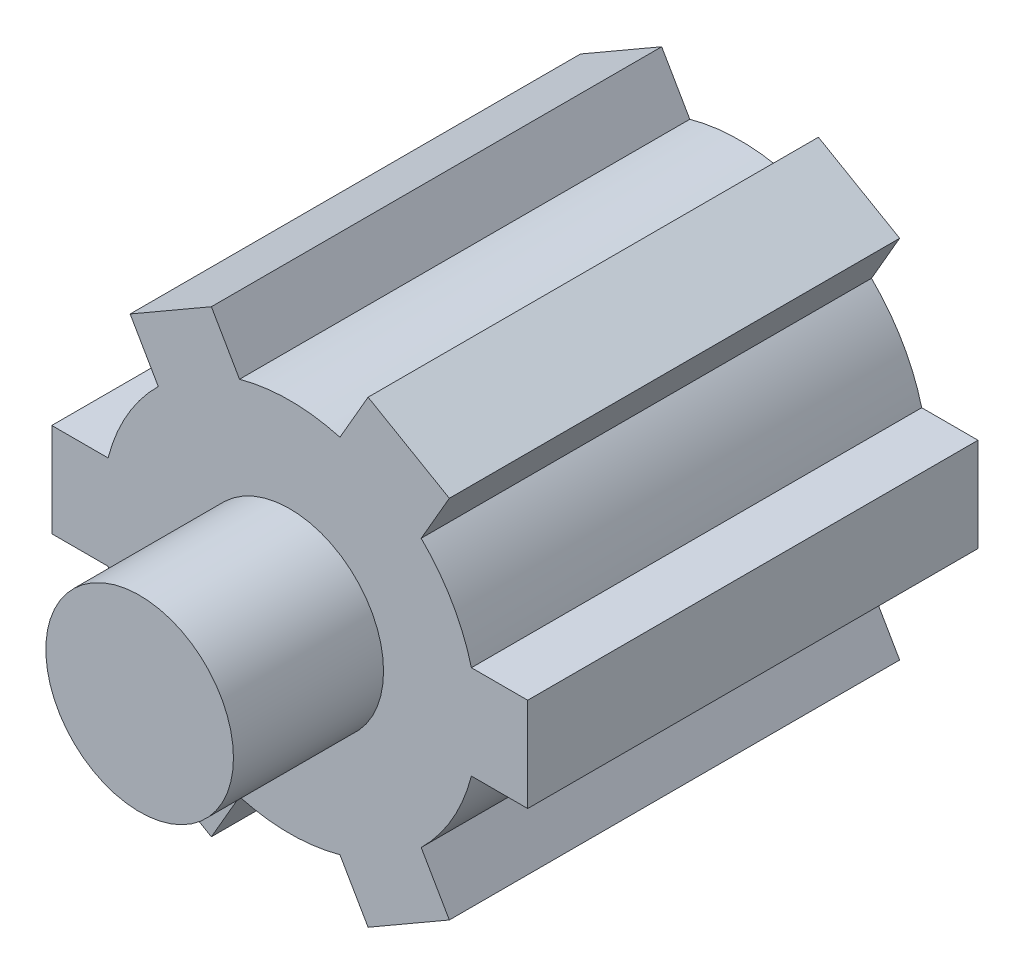
ISO-10303-21;
HEADER;
FILE_DESCRIPTION(('STEP AP214'),'2;1');
FILE_NAME('part.step','',(''),(''),'','','');
FILE_SCHEMA(('AUTOMOTIVE_DESIGN { 1 0 10303 214 1 1 1 1 }'));
ENDSEC;
DATA;
#1=APPLICATION_CONTEXT('core data for automotive mechanical design processes');
#2=APPLICATION_PROTOCOL_DEFINITION('international standard','automotive_design',2000,#1);
#3=PRODUCT_CONTEXT('',#1,'mechanical');
#4=PRODUCT('Part','Part','',(#3));
#5=PRODUCT_RELATED_PRODUCT_CATEGORY('part','',(#4));
#6=PRODUCT_DEFINITION_FORMATION('','',#4);
#7=PRODUCT_DEFINITION_CONTEXT('part definition',#1,'design');
#8=PRODUCT_DEFINITION('design','',#6,#7);
#9=PRODUCT_DEFINITION_SHAPE('','',#8);
#10=(LENGTH_UNIT() NAMED_UNIT(*) SI_UNIT(.MILLI.,.METRE.));
#11=(NAMED_UNIT(*) PLANE_ANGLE_UNIT() SI_UNIT($,.RADIAN.));
#12=(NAMED_UNIT(*) SI_UNIT($,.STERADIAN.) SOLID_ANGLE_UNIT());
#13=UNCERTAINTY_MEASURE_WITH_UNIT(LENGTH_MEASURE(1.E-05),#10,'distance_accuracy_value','');
#14=(GEOMETRIC_REPRESENTATION_CONTEXT(3) GLOBAL_UNCERTAINTY_ASSIGNED_CONTEXT((#13)) GLOBAL_UNIT_ASSIGNED_CONTEXT((#10,
#11,#12)) REPRESENTATION_CONTEXT('',''));
#15=CARTESIAN_POINT('',(0.,0.,0.));
#16=DIRECTION('',(0.,0.,1.));
#17=DIRECTION('',(1.,0.,0.));
#18=AXIS2_PLACEMENT_3D('',#15,#16,#17);
#19=CARTESIAN_POINT('',(-10.0667013276303,1.984375,9.525));
#20=DIRECTION('',(0.,-1.,0.));
#21=DIRECTION('',(0.,0.,-1.));
#22=AXIS2_PLACEMENT_3D('',#19,#20,#21);
#23=PLANE('',#22);
#24=DIRECTION('',(-1.,0.,0.));
#25=VECTOR('',#24,1.);
#26=CARTESIAN_POINT('',(-10.0667013276303,1.984375,-9.525));
#27=LINE('',#26,#25);
#28=CARTESIAN_POINT('',(-7.68545132763034,1.984375,-9.525));
#29=VERTEX_POINT('',#28);
#30=CARTESIAN_POINT('',(-10.0667013276303,1.984375,-9.525));
#31=VERTEX_POINT('',#30);
#32=EDGE_CURVE('E224',#29,#31,#27,.T.);
#33=ORIENTED_EDGE('',*,*,#32,.T.);
#34=DIRECTION('',(0.,0.,-1.));
#35=VECTOR('',#34,1.);
#36=CARTESIAN_POINT('',(-10.0667013276303,1.984375,9.525));
#37=LINE('',#36,#35);
#38=CARTESIAN_POINT('',(-10.0667013276303,1.984375,9.525));
#39=VERTEX_POINT('',#38);
#40=EDGE_CURVE('E11',#39,#31,#37,.T.);
#41=ORIENTED_EDGE('',*,*,#40,.F.);
#42=DIRECTION('',(-1.,0.,0.));
#43=VECTOR('',#42,1.);
#44=CARTESIAN_POINT('',(-10.0667013276303,1.984375,9.525));
#45=LINE('',#44,#43);
#46=CARTESIAN_POINT('',(-7.68545132763034,1.984375,9.525));
#47=VERTEX_POINT('',#46);
#48=EDGE_CURVE('E271',#47,#39,#45,.T.);
#49=ORIENTED_EDGE('',*,*,#48,.F.);
#50=DIRECTION('',(0.,0.,-1.));
#51=VECTOR('',#50,1.);
#52=CARTESIAN_POINT('',(-7.68545132763034,1.984375,9.525));
#53=LINE('',#52,#51);
#54=EDGE_CURVE('E220',#47,#29,#53,.T.);
#55=ORIENTED_EDGE('',*,*,#54,.T.);
#56=EDGE_LOOP('',(#33,#41,#49,#55));
#57=FACE_BOUND('',#56,.T.);
#58=ADVANCED_FACE('F32',(#57),#23,.F.);
#59=CARTESIAN_POINT('',(-10.0667013276303,1.984375,9.525));
#60=DIRECTION('',(1.,0.,0.));
#61=DIRECTION('',(0.,0.,-1.));
#62=AXIS2_PLACEMENT_3D('',#59,#60,#61);
#63=PLANE('',#62);
#64=DIRECTION('',(0.,-1.,0.));
#65=VECTOR('',#64,1.);
#66=CARTESIAN_POINT('',(-10.0667013276303,1.984375,-9.525));
#67=LINE('',#66,#65);
#68=CARTESIAN_POINT('',(-10.0667013276303,-1.984375,-9.525));
#69=VERTEX_POINT('',#68);
#70=EDGE_CURVE('E227',#31,#69,#67,.T.);
#71=ORIENTED_EDGE('',*,*,#70,.T.);
#72=DIRECTION('',(0.,0.,-1.));
#73=VECTOR('',#72,1.);
#74=CARTESIAN_POINT('',(-10.0667013276303,-1.984375,9.525));
#75=LINE('',#74,#73);
#76=CARTESIAN_POINT('',(-10.0667013276303,-1.984375,9.525));
#77=VERTEX_POINT('',#76);
#78=EDGE_CURVE('E40',#77,#69,#75,.T.);
#79=ORIENTED_EDGE('',*,*,#78,.F.);
#80=DIRECTION('',(0.,-1.,0.));
#81=VECTOR('',#80,1.);
#82=CARTESIAN_POINT('',(-10.0667013276303,1.984375,9.525));
#83=LINE('',#82,#81);
#84=EDGE_CURVE('E139',#39,#77,#83,.T.);
#85=ORIENTED_EDGE('',*,*,#84,.F.);
#86=ORIENTED_EDGE('',*,*,#40,.T.);
#87=EDGE_LOOP('',(#71,#79,#85,#86));
#88=FACE_BOUND('',#87,.T.);
#89=ADVANCED_FACE('F410',(#88),#63,.F.);
#90=CARTESIAN_POINT('',(-10.0667013276303,-1.984375,9.525));
#91=DIRECTION('',(0.,1.,0.));
#92=DIRECTION('',(-1.,0.,0.));
#93=AXIS2_PLACEMENT_3D('',#90,#91,#92);
#94=PLANE('',#93);
#95=DIRECTION('',(1.,0.,0.));
#96=VECTOR('',#95,1.);
#97=CARTESIAN_POINT('',(-10.0667013276303,-1.984375,-9.525));
#98=LINE('',#97,#96);
#99=CARTESIAN_POINT('',(-7.68545132763034,-1.984375,-9.525));
#100=VERTEX_POINT('',#99);
#101=EDGE_CURVE('E230',#69,#100,#98,.T.);
#102=ORIENTED_EDGE('',*,*,#101,.T.);
#103=DIRECTION('',(0.,0.,-1.));
#104=VECTOR('',#103,1.);
#105=CARTESIAN_POINT('',(-7.68545132763034,-1.984375,9.525));
#106=LINE('',#105,#104);
#107=CARTESIAN_POINT('',(-7.68545132763034,-1.984375,9.525));
#108=VERTEX_POINT('',#107);
#109=EDGE_CURVE('E326',#108,#100,#106,.T.);
#110=ORIENTED_EDGE('',*,*,#109,.F.);
#111=DIRECTION('',(1.,0.,0.));
#112=VECTOR('',#111,1.);
#113=CARTESIAN_POINT('',(-10.0667013276303,-1.984375,9.525));
#114=LINE('',#113,#112);
#115=EDGE_CURVE('E334',#77,#108,#114,.T.);
#116=ORIENTED_EDGE('',*,*,#115,.F.);
#117=ORIENTED_EDGE('',*,*,#78,.T.);
#118=EDGE_LOOP('',(#102,#110,#116,#117));
#119=FACE_BOUND('',#118,.T.);
#120=ADVANCED_FACE('F332',(#119),#94,.F.);
#121=CARTESIAN_POINT('',(0.,0.,9.525));
#122=DIRECTION('',(0.,0.,-1.));
#123=DIRECTION('',(-1.,0.,0.));
#124=AXIS2_PLACEMENT_3D('',#121,#122,#123);
#125=CYLINDRICAL_SURFACE('',#124,7.9375);
#126=CARTESIAN_POINT('',(0.,0.,-9.525));
#127=DIRECTION('',(0.,0.,1.));
#128=DIRECTION('',(1.,0.,0.));
#129=AXIS2_PLACEMENT_3D('',#126,#127,#128);
#130=CIRCLE('',#129,7.9375);
#131=CARTESIAN_POINT('',(-5.56124482444991,-5.66360858927672,-9.525));
#132=VERTEX_POINT('',#131);
#133=EDGE_CURVE('E232',#100,#132,#130,.T.);
#134=ORIENTED_EDGE('',*,*,#133,.T.);
#135=DIRECTION('',(0.,0.,-1.));
#136=VECTOR('',#135,1.);
#137=CARTESIAN_POINT('',(-5.56124482444991,-5.66360858927672,9.525));
#138=LINE('',#137,#136);
#139=CARTESIAN_POINT('',(-5.56124482444991,-5.66360858927672,9.525));
#140=VERTEX_POINT('',#139);
#141=EDGE_CURVE('E323',#140,#132,#138,.T.);
#142=ORIENTED_EDGE('',*,*,#141,.F.);
#143=CARTESIAN_POINT('',(0.,0.,9.525));
#144=DIRECTION('',(0.,0.,1.));
#145=DIRECTION('',(1.,0.,0.));
#146=AXIS2_PLACEMENT_3D('',#143,#144,#145);
#147=CIRCLE('',#146,7.9375);
#148=EDGE_CURVE('E352',#108,#140,#147,.T.);
#149=ORIENTED_EDGE('',*,*,#148,.F.);
#150=ORIENTED_EDGE('',*,*,#109,.T.);
#151=EDGE_LOOP('',(#134,#142,#149,#150));
#152=FACE_BOUND('',#151,.T.);
#153=ADVANCED_FACE('F343',(#152),#125,.T.);
#154=CARTESIAN_POINT('',(-6.75186982444991,-7.72583158203842,9.525));
#155=DIRECTION('',(0.866025403784439,-0.5,0.));
#156=DIRECTION('',(0.5,0.866025403784438,0.));
#157=AXIS2_PLACEMENT_3D('',#154,#155,#156);
#158=PLANE('',#157);
#159=DIRECTION('',(-0.5,-0.866025403784438,0.));
#160=VECTOR('',#159,1.);
#161=CARTESIAN_POINT('',(-6.75186982444991,-7.72583158203842,-9.525));
#162=LINE('',#161,#160);
#163=CARTESIAN_POINT('',(-6.75186982444991,-7.72583158203842,-9.525));
#164=VERTEX_POINT('',#163);
#165=EDGE_CURVE('E234',#132,#164,#162,.T.);
#166=ORIENTED_EDGE('',*,*,#165,.T.);
#167=DIRECTION('',(0.,0.,-1.));
#168=VECTOR('',#167,1.);
#169=CARTESIAN_POINT('',(-6.75186982444991,-7.72583158203842,9.525));
#170=LINE('',#169,#168);
#171=CARTESIAN_POINT('',(-6.75186982444991,-7.72583158203842,9.525));
#172=VERTEX_POINT('',#171);
#173=EDGE_CURVE('E320',#172,#164,#170,.T.);
#174=ORIENTED_EDGE('',*,*,#173,.F.);
#175=DIRECTION('',(-0.5,-0.866025403784438,0.));
#176=VECTOR('',#175,1.);
#177=CARTESIAN_POINT('',(-6.75186982444991,-7.72583158203842,9.525));
#178=LINE('',#177,#176);
#179=EDGE_CURVE('E349',#140,#172,#178,.T.);
#180=ORIENTED_EDGE('',*,*,#179,.F.);
#181=ORIENTED_EDGE('',*,*,#141,.T.);
#182=EDGE_LOOP('',(#166,#174,#180,#181));
#183=FACE_BOUND('',#182,.T.);
#184=ADVANCED_FACE('F347',(#183),#158,.F.);
#185=CARTESIAN_POINT('',(-6.75186982444991,-7.72583158203842,9.525));
#186=DIRECTION('',(0.5,0.866025403784439,0.));
#187=DIRECTION('',(-0.866025403784439,0.5,0.));
#188=AXIS2_PLACEMENT_3D('',#185,#186,#187);
#189=PLANE('',#188);
#190=DIRECTION('',(0.866025403784439,-0.5,0.));
#191=VECTOR('',#190,1.);
#192=CARTESIAN_POINT('',(-6.75186982444991,-7.72583158203842,-9.525));
#193=LINE('',#192,#191);
#194=CARTESIAN_POINT('',(-3.31483150318042,-9.71020658203842,-9.525));
#195=VERTEX_POINT('',#194);
#196=EDGE_CURVE('E236',#164,#195,#193,.T.);
#197=ORIENTED_EDGE('',*,*,#196,.T.);
#198=DIRECTION('',(0.,0.,-1.));
#199=VECTOR('',#198,1.);
#200=CARTESIAN_POINT('',(-3.31483150318042,-9.71020658203842,9.525));
#201=LINE('',#200,#199);
#202=CARTESIAN_POINT('',(-3.31483150318042,-9.71020658203842,9.525));
#203=VERTEX_POINT('',#202);
#204=EDGE_CURVE('E317',#203,#195,#201,.T.);
#205=ORIENTED_EDGE('',*,*,#204,.F.);
#206=DIRECTION('',(0.866025403784439,-0.5,0.));
#207=VECTOR('',#206,1.);
#208=CARTESIAN_POINT('',(-6.75186982444991,-7.72583158203842,9.525));
#209=LINE('',#208,#207);
#210=EDGE_CURVE('E351',#172,#203,#209,.T.);
#211=ORIENTED_EDGE('',*,*,#210,.F.);
#212=ORIENTED_EDGE('',*,*,#173,.T.);
#213=EDGE_LOOP('',(#197,#205,#211,#212));
#214=FACE_BOUND('',#213,.T.);
#215=ADVANCED_FACE('F423',(#214),#189,.F.);
#216=CARTESIAN_POINT('',(-3.31483150318042,-9.71020658203842,9.525));
#217=DIRECTION('',(-0.866025403784439,0.5,0.));
#218=DIRECTION('',(-0.5,-0.866025403784439,0.));
#219=AXIS2_PLACEMENT_3D('',#216,#217,#218);
#220=PLANE('',#219);
#221=DIRECTION('',(0.5,0.866025403784439,0.));
#222=VECTOR('',#221,1.);
#223=CARTESIAN_POINT('',(-3.31483150318042,-9.71020658203842,-9.525));
#224=LINE('',#223,#222);
#225=CARTESIAN_POINT('',(-2.12420650318042,-7.64798358927672,-9.525));
#226=VERTEX_POINT('',#225);
#227=EDGE_CURVE('E238',#195,#226,#224,.T.);
#228=ORIENTED_EDGE('',*,*,#227,.T.);
#229=DIRECTION('',(0.,0.,-1.));
#230=VECTOR('',#229,1.);
#231=CARTESIAN_POINT('',(-2.12420650318042,-7.64798358927672,9.525));
#232=LINE('',#231,#230);
#233=CARTESIAN_POINT('',(-2.12420650318042,-7.64798358927672,9.525));
#234=VERTEX_POINT('',#233);
#235=EDGE_CURVE('E314',#234,#226,#232,.T.);
#236=ORIENTED_EDGE('',*,*,#235,.F.);
#237=DIRECTION('',(0.5,0.866025403784439,0.));
#238=VECTOR('',#237,1.);
#239=CARTESIAN_POINT('',(-3.31483150318042,-9.71020658203842,9.525));
#240=LINE('',#239,#238);
#241=EDGE_CURVE('E354',#203,#234,#240,.T.);
#242=ORIENTED_EDGE('',*,*,#241,.F.);
#243=ORIENTED_EDGE('',*,*,#204,.T.);
#244=EDGE_LOOP('',(#228,#236,#242,#243));
#245=FACE_BOUND('',#244,.T.);
#246=ADVANCED_FACE('F426',(#245),#220,.F.);
#247=CARTESIAN_POINT('',(0.,0.,9.525));
#248=DIRECTION('',(0.,0.,-1.));
#249=DIRECTION('',(-1.,0.,0.));
#250=AXIS2_PLACEMENT_3D('',#247,#248,#249);
#251=CYLINDRICAL_SURFACE('',#250,7.9375);
#252=CARTESIAN_POINT('',(0.,0.,-9.525));
#253=DIRECTION('',(0.,0.,1.));
#254=DIRECTION('',(1.,0.,0.));
#255=AXIS2_PLACEMENT_3D('',#252,#253,#254);
#256=CIRCLE('',#255,7.9375);
#257=CARTESIAN_POINT('',(2.12420650318043,-7.64798358927672,-9.525));
#258=VERTEX_POINT('',#257);
#259=EDGE_CURVE('E240',#226,#258,#256,.T.);
#260=ORIENTED_EDGE('',*,*,#259,.T.);
#261=DIRECTION('',(0.,0.,-1.));
#262=VECTOR('',#261,1.);
#263=CARTESIAN_POINT('',(2.12420650318043,-7.64798358927672,9.525));
#264=LINE('',#263,#262);
#265=CARTESIAN_POINT('',(2.12420650318043,-7.64798358927672,9.525));
#266=VERTEX_POINT('',#265);
#267=EDGE_CURVE('E311',#266,#258,#264,.T.);
#268=ORIENTED_EDGE('',*,*,#267,.F.);
#269=CARTESIAN_POINT('',(0.,0.,9.525));
#270=DIRECTION('',(0.,0.,1.));
#271=DIRECTION('',(1.,0.,0.));
#272=AXIS2_PLACEMENT_3D('',#269,#270,#271);
#273=CIRCLE('',#272,7.9375);
#274=EDGE_CURVE('E360',#234,#266,#273,.T.);
#275=ORIENTED_EDGE('',*,*,#274,.F.);
#276=ORIENTED_EDGE('',*,*,#235,.T.);
#277=EDGE_LOOP('',(#260,#268,#275,#276));
#278=FACE_BOUND('',#277,.T.);
#279=ADVANCED_FACE('F430',(#278),#251,.T.);
#280=CARTESIAN_POINT('',(3.31483150318043,-9.71020658203841,9.525));
#281=DIRECTION('',(0.866025403784439,0.5,0.));
#282=DIRECTION('',(-0.5,0.866025403784439,0.));
#283=AXIS2_PLACEMENT_3D('',#280,#281,#282);
#284=PLANE('',#283);
#285=DIRECTION('',(0.5,-0.866025403784438,0.));
#286=VECTOR('',#285,1.);
#287=CARTESIAN_POINT('',(3.31483150318043,-9.71020658203841,-9.525));
#288=LINE('',#287,#286);
#289=CARTESIAN_POINT('',(3.31483150318043,-9.71020658203841,-9.525));
#290=VERTEX_POINT('',#289);
#291=EDGE_CURVE('E242',#258,#290,#288,.T.);
#292=ORIENTED_EDGE('',*,*,#291,.T.);
#293=DIRECTION('',(0.,0.,-1.));
#294=VECTOR('',#293,1.);
#295=CARTESIAN_POINT('',(3.31483150318043,-9.71020658203841,9.525));
#296=LINE('',#295,#294);
#297=CARTESIAN_POINT('',(3.31483150318043,-9.71020658203841,9.525));
#298=VERTEX_POINT('',#297);
#299=EDGE_CURVE('E308',#298,#290,#296,.T.);
#300=ORIENTED_EDGE('',*,*,#299,.F.);
#301=DIRECTION('',(0.5,-0.866025403784438,0.));
#302=VECTOR('',#301,1.);
#303=CARTESIAN_POINT('',(3.31483150318043,-9.71020658203841,9.525));
#304=LINE('',#303,#302);
#305=EDGE_CURVE('E362',#266,#298,#304,.T.);
#306=ORIENTED_EDGE('',*,*,#305,.F.);
#307=ORIENTED_EDGE('',*,*,#267,.T.);
#308=EDGE_LOOP('',(#292,#300,#306,#307));
#309=FACE_BOUND('',#308,.T.);
#310=ADVANCED_FACE('F434',(#309),#284,.F.);
#311=CARTESIAN_POINT('',(3.31483150318043,-9.71020658203841,9.525));
#312=DIRECTION('',(-0.5,0.866025403784439,0.));
#313=DIRECTION('',(-0.866025403784439,-0.5,0.));
#314=AXIS2_PLACEMENT_3D('',#311,#312,#313);
#315=PLANE('',#314);
#316=DIRECTION('',(0.866025403784439,0.5,0.));
#317=VECTOR('',#316,1.);
#318=CARTESIAN_POINT('',(3.31483150318043,-9.71020658203841,-9.525));
#319=LINE('',#318,#317);
#320=CARTESIAN_POINT('',(6.75186982444992,-7.72583158203841,-9.525));
#321=VERTEX_POINT('',#320);
#322=EDGE_CURVE('E244',#290,#321,#319,.T.);
#323=ORIENTED_EDGE('',*,*,#322,.T.);
#324=DIRECTION('',(0.,0.,-1.));
#325=VECTOR('',#324,1.);
#326=CARTESIAN_POINT('',(6.75186982444992,-7.72583158203841,9.525));
#327=LINE('',#326,#325);
#328=CARTESIAN_POINT('',(6.75186982444992,-7.72583158203841,9.525));
#329=VERTEX_POINT('',#328);
#330=EDGE_CURVE('E305',#329,#321,#327,.T.);
#331=ORIENTED_EDGE('',*,*,#330,.F.);
#332=DIRECTION('',(0.866025403784439,0.5,0.));
#333=VECTOR('',#332,1.);
#334=CARTESIAN_POINT('',(3.31483150318043,-9.71020658203841,9.525));
#335=LINE('',#334,#333);
#336=EDGE_CURVE('E364',#298,#329,#335,.T.);
#337=ORIENTED_EDGE('',*,*,#336,.F.);
#338=ORIENTED_EDGE('',*,*,#299,.T.);
#339=EDGE_LOOP('',(#323,#331,#337,#338));
#340=FACE_BOUND('',#339,.T.);
#341=ADVANCED_FACE('F438',(#340),#315,.F.);
#342=CARTESIAN_POINT('',(6.75186982444992,-7.72583158203841,9.525));
#343=DIRECTION('',(-0.866025403784438,-0.500000000000001,0.));
#344=DIRECTION('',(0.500000000000001,-0.866025403784438,0.));
#345=AXIS2_PLACEMENT_3D('',#342,#343,#344);
#346=PLANE('',#345);
#347=DIRECTION('',(-0.5,0.866025403784438,0.));
#348=VECTOR('',#347,1.);
#349=CARTESIAN_POINT('',(6.75186982444992,-7.72583158203841,-9.525));
#350=LINE('',#349,#348);
#351=CARTESIAN_POINT('',(5.56124482444992,-5.66360858927671,-9.525));
#352=VERTEX_POINT('',#351);
#353=EDGE_CURVE('E246',#321,#352,#350,.T.);
#354=ORIENTED_EDGE('',*,*,#353,.T.);
#355=DIRECTION('',(0.,0.,-1.));
#356=VECTOR('',#355,1.);
#357=CARTESIAN_POINT('',(5.56124482444992,-5.66360858927671,9.525));
#358=LINE('',#357,#356);
#359=CARTESIAN_POINT('',(5.56124482444992,-5.66360858927671,9.525));
#360=VERTEX_POINT('',#359);
#361=EDGE_CURVE('E302',#360,#352,#358,.T.);
#362=ORIENTED_EDGE('',*,*,#361,.F.);
#363=DIRECTION('',(-0.5,0.866025403784438,0.));
#364=VECTOR('',#363,1.);
#365=CARTESIAN_POINT('',(6.75186982444992,-7.72583158203841,9.525));
#366=LINE('',#365,#364);
#367=EDGE_CURVE('E366',#329,#360,#366,.T.);
#368=ORIENTED_EDGE('',*,*,#367,.F.);
#369=ORIENTED_EDGE('',*,*,#330,.T.);
#370=EDGE_LOOP('',(#354,#362,#368,#369));
#371=FACE_BOUND('',#370,.T.);
#372=ADVANCED_FACE('F442',(#371),#346,.F.);
#373=CARTESIAN_POINT('',(0.,0.,9.525));
#374=DIRECTION('',(0.,0.,-1.));
#375=DIRECTION('',(-1.,0.,0.));
#376=AXIS2_PLACEMENT_3D('',#373,#374,#375);
#377=CYLINDRICAL_SURFACE('',#376,7.9375);
#378=CARTESIAN_POINT('',(0.,0.,-9.525));
#379=DIRECTION('',(0.,0.,1.));
#380=DIRECTION('',(1.,0.,0.));
#381=AXIS2_PLACEMENT_3D('',#378,#379,#380);
#382=CIRCLE('',#381,7.9375);
#383=CARTESIAN_POINT('',(7.68545132763034,-1.984375,-9.525));
#384=VERTEX_POINT('',#383);
#385=EDGE_CURVE('E248',#352,#384,#382,.T.);
#386=ORIENTED_EDGE('',*,*,#385,.T.);
#387=DIRECTION('',(0.,0.,-1.));
#388=VECTOR('',#387,1.);
#389=CARTESIAN_POINT('',(7.68545132763034,-1.984375,9.525));
#390=LINE('',#389,#388);
#391=CARTESIAN_POINT('',(7.68545132763034,-1.984375,9.525));
#392=VERTEX_POINT('',#391);
#393=EDGE_CURVE('E299',#392,#384,#390,.T.);
#394=ORIENTED_EDGE('',*,*,#393,.F.);
#395=CARTESIAN_POINT('',(0.,0.,9.525));
#396=DIRECTION('',(0.,0.,1.));
#397=DIRECTION('',(1.,0.,0.));
#398=AXIS2_PLACEMENT_3D('',#395,#396,#397);
#399=CIRCLE('',#398,7.9375);
#400=EDGE_CURVE('E368',#360,#392,#399,.T.);
#401=ORIENTED_EDGE('',*,*,#400,.F.);
#402=ORIENTED_EDGE('',*,*,#361,.T.);
#403=EDGE_LOOP('',(#386,#394,#401,#402));
#404=FACE_BOUND('',#403,.T.);
#405=ADVANCED_FACE('F446',(#404),#377,.T.);
#406=CARTESIAN_POINT('',(10.0667013276303,-1.984375,9.525));
#407=DIRECTION('',(0.,1.,0.));
#408=DIRECTION('',(0.,0.,1.));
#409=AXIS2_PLACEMENT_3D('',#406,#407,#408);
#410=PLANE('',#409);
#411=DIRECTION('',(1.,0.,0.));
#412=VECTOR('',#411,1.);
#413=CARTESIAN_POINT('',(10.0667013276303,-1.984375,-9.525));
#414=LINE('',#413,#412);
#415=CARTESIAN_POINT('',(10.0667013276303,-1.984375,-9.525));
#416=VERTEX_POINT('',#415);
#417=EDGE_CURVE('E250',#384,#416,#414,.T.);
#418=ORIENTED_EDGE('',*,*,#417,.T.);
#419=DIRECTION('',(0.,0.,-1.));
#420=VECTOR('',#419,1.);
#421=CARTESIAN_POINT('',(10.0667013276303,-1.984375,9.525));
#422=LINE('',#421,#420);
#423=CARTESIAN_POINT('',(10.0667013276303,-1.984375,9.525));
#424=VERTEX_POINT('',#423);
#425=EDGE_CURVE('E296',#424,#416,#422,.T.);
#426=ORIENTED_EDGE('',*,*,#425,.F.);
#427=DIRECTION('',(1.,0.,0.));
#428=VECTOR('',#427,1.);
#429=CARTESIAN_POINT('',(10.0667013276303,-1.984375,9.525));
#430=LINE('',#429,#428);
#431=EDGE_CURVE('E370',#392,#424,#430,.T.);
#432=ORIENTED_EDGE('',*,*,#431,.F.);
#433=ORIENTED_EDGE('',*,*,#393,.T.);
#434=EDGE_LOOP('',(#418,#426,#432,#433));
#435=FACE_BOUND('',#434,.T.);
#436=ADVANCED_FACE('F450',(#435),#410,.F.);
#437=CARTESIAN_POINT('',(10.0667013276303,-1.984375,9.525));
#438=DIRECTION('',(-1.,0.,0.));
#439=DIRECTION('',(0.,-1.,0.));
#440=AXIS2_PLACEMENT_3D('',#437,#438,#439);
#441=PLANE('',#440);
#442=DIRECTION('',(0.,1.,0.));
#443=VECTOR('',#442,1.);
#444=CARTESIAN_POINT('',(10.0667013276303,-1.984375,-9.525));
#445=LINE('',#444,#443);
#446=CARTESIAN_POINT('',(10.0667013276303,1.984375,-9.525));
#447=VERTEX_POINT('',#446);
#448=EDGE_CURVE('E252',#416,#447,#445,.T.);
#449=ORIENTED_EDGE('',*,*,#448,.T.);
#450=DIRECTION('',(0.,0.,-1.));
#451=VECTOR('',#450,1.);
#452=CARTESIAN_POINT('',(10.0667013276303,1.984375,9.525));
#453=LINE('',#452,#451);
#454=CARTESIAN_POINT('',(10.0667013276303,1.984375,9.525));
#455=VERTEX_POINT('',#454);
#456=EDGE_CURVE('E293',#455,#447,#453,.T.);
#457=ORIENTED_EDGE('',*,*,#456,.F.);
#458=DIRECTION('',(0.,1.,0.));
#459=VECTOR('',#458,1.);
#460=CARTESIAN_POINT('',(10.0667013276303,-1.984375,9.525));
#461=LINE('',#460,#459);
#462=EDGE_CURVE('E372',#424,#455,#461,.T.);
#463=ORIENTED_EDGE('',*,*,#462,.F.);
#464=ORIENTED_EDGE('',*,*,#425,.T.);
#465=EDGE_LOOP('',(#449,#457,#463,#464));
#466=FACE_BOUND('',#465,.T.);
#467=ADVANCED_FACE('F454',(#466),#441,.F.);
#468=CARTESIAN_POINT('',(10.0667013276303,1.984375,9.525));
#469=DIRECTION('',(0.,-1.,0.));
#470=DIRECTION('',(1.,0.,0.));
#471=AXIS2_PLACEMENT_3D('',#468,#469,#470);
#472=PLANE('',#471);
#473=DIRECTION('',(-1.,0.,0.));
#474=VECTOR('',#473,1.);
#475=CARTESIAN_POINT('',(10.0667013276303,1.984375,-9.525));
#476=LINE('',#475,#474);
#477=CARTESIAN_POINT('',(7.68545132763034,1.984375,-9.525));
#478=VERTEX_POINT('',#477);
#479=EDGE_CURVE('E254',#447,#478,#476,.T.);
#480=ORIENTED_EDGE('',*,*,#479,.T.);
#481=DIRECTION('',(0.,0.,-1.));
#482=VECTOR('',#481,1.);
#483=CARTESIAN_POINT('',(7.68545132763034,1.984375,9.525));
#484=LINE('',#483,#482);
#485=CARTESIAN_POINT('',(7.68545132763034,1.984375,9.525));
#486=VERTEX_POINT('',#485);
#487=EDGE_CURVE('E290',#486,#478,#484,.T.);
#488=ORIENTED_EDGE('',*,*,#487,.F.);
#489=DIRECTION('',(-1.,0.,0.));
#490=VECTOR('',#489,1.);
#491=CARTESIAN_POINT('',(10.0667013276303,1.984375,9.525));
#492=LINE('',#491,#490);
#493=EDGE_CURVE('E374',#455,#486,#492,.T.);
#494=ORIENTED_EDGE('',*,*,#493,.F.);
#495=ORIENTED_EDGE('',*,*,#456,.T.);
#496=EDGE_LOOP('',(#480,#488,#494,#495));
#497=FACE_BOUND('',#496,.T.);
#498=ADVANCED_FACE('F458',(#497),#472,.F.);
#499=CARTESIAN_POINT('',(0.,0.,9.525));
#500=DIRECTION('',(0.,0.,-1.));
#501=DIRECTION('',(-1.,0.,0.));
#502=AXIS2_PLACEMENT_3D('',#499,#500,#501);
#503=CYLINDRICAL_SURFACE('',#502,7.9375);
#504=CARTESIAN_POINT('',(0.,0.,-9.525));
#505=DIRECTION('',(0.,0.,1.));
#506=DIRECTION('',(1.,0.,0.));
#507=AXIS2_PLACEMENT_3D('',#504,#505,#506);
#508=CIRCLE('',#507,7.9375);
#509=CARTESIAN_POINT('',(5.56124482444991,5.66360858927672,-9.525));
#510=VERTEX_POINT('',#509);
#511=EDGE_CURVE('E256',#478,#510,#508,.T.);
#512=ORIENTED_EDGE('',*,*,#511,.T.);
#513=DIRECTION('',(0.,0.,-1.));
#514=VECTOR('',#513,1.);
#515=CARTESIAN_POINT('',(5.56124482444991,5.66360858927672,9.525));
#516=LINE('',#515,#514);
#517=CARTESIAN_POINT('',(5.56124482444991,5.66360858927672,9.525));
#518=VERTEX_POINT('',#517);
#519=EDGE_CURVE('E287',#518,#510,#516,.T.);
#520=ORIENTED_EDGE('',*,*,#519,.F.);
#521=CARTESIAN_POINT('',(0.,0.,9.525));
#522=DIRECTION('',(0.,0.,1.));
#523=DIRECTION('',(1.,0.,0.));
#524=AXIS2_PLACEMENT_3D('',#521,#522,#523);
#525=CIRCLE('',#524,7.9375);
#526=EDGE_CURVE('E376',#486,#518,#525,.T.);
#527=ORIENTED_EDGE('',*,*,#526,.F.);
#528=ORIENTED_EDGE('',*,*,#487,.T.);
#529=EDGE_LOOP('',(#512,#520,#527,#528));
#530=FACE_BOUND('',#529,.T.);
#531=ADVANCED_FACE('F462',(#530),#503,.T.);
#532=CARTESIAN_POINT('',(6.75186982444992,7.72583158203842,9.525));
#533=DIRECTION('',(-0.866025403784439,0.5,0.));
#534=DIRECTION('',(-0.5,-0.866025403784439,0.));
#535=AXIS2_PLACEMENT_3D('',#532,#533,#534);
#536=PLANE('',#535);
#537=DIRECTION('',(0.5,0.866025403784439,0.));
#538=VECTOR('',#537,1.);
#539=CARTESIAN_POINT('',(6.75186982444992,7.72583158203842,-9.525));
#540=LINE('',#539,#538);
#541=CARTESIAN_POINT('',(6.75186982444992,7.72583158203842,-9.525));
#542=VERTEX_POINT('',#541);
#543=EDGE_CURVE('E258',#510,#542,#540,.T.);
#544=ORIENTED_EDGE('',*,*,#543,.T.);
#545=DIRECTION('',(0.,0.,-1.));
#546=VECTOR('',#545,1.);
#547=CARTESIAN_POINT('',(6.75186982444992,7.72583158203842,9.525));
#548=LINE('',#547,#546);
#549=CARTESIAN_POINT('',(6.75186982444992,7.72583158203842,9.525));
#550=VERTEX_POINT('',#549);
#551=EDGE_CURVE('E284',#550,#542,#548,.T.);
#552=ORIENTED_EDGE('',*,*,#551,.F.);
#553=DIRECTION('',(0.5,0.866025403784439,0.));
#554=VECTOR('',#553,1.);
#555=CARTESIAN_POINT('',(6.75186982444992,7.72583158203842,9.525));
#556=LINE('',#555,#554);
#557=EDGE_CURVE('E378',#518,#550,#556,.T.);
#558=ORIENTED_EDGE('',*,*,#557,.F.);
#559=ORIENTED_EDGE('',*,*,#519,.T.);
#560=EDGE_LOOP('',(#544,#552,#558,#559));
#561=FACE_BOUND('',#560,.T.);
#562=ADVANCED_FACE('F466',(#561),#536,.F.);
#563=CARTESIAN_POINT('',(6.75186982444992,7.72583158203842,9.525));
#564=DIRECTION('',(-0.5,-0.866025403784439,0.));
#565=DIRECTION('',(0.866025403784439,-0.5,0.));
#566=AXIS2_PLACEMENT_3D('',#563,#564,#565);
#567=PLANE('',#566);
#568=DIRECTION('',(-0.866025403784439,0.5,0.));
#569=VECTOR('',#568,1.);
#570=CARTESIAN_POINT('',(6.75186982444992,7.72583158203842,-9.525));
#571=LINE('',#570,#569);
#572=CARTESIAN_POINT('',(3.31483150318043,9.71020658203842,-9.525));
#573=VERTEX_POINT('',#572);
#574=EDGE_CURVE('E260',#542,#573,#571,.T.);
#575=ORIENTED_EDGE('',*,*,#574,.T.);
#576=DIRECTION('',(0.,0.,-1.));
#577=VECTOR('',#576,1.);
#578=CARTESIAN_POINT('',(3.31483150318043,9.71020658203842,9.525));
#579=LINE('',#578,#577);
#580=CARTESIAN_POINT('',(3.31483150318043,9.71020658203842,9.525));
#581=VERTEX_POINT('',#580);
#582=EDGE_CURVE('E281',#581,#573,#579,.T.);
#583=ORIENTED_EDGE('',*,*,#582,.F.);
#584=DIRECTION('',(-0.866025403784439,0.5,0.));
#585=VECTOR('',#584,1.);
#586=CARTESIAN_POINT('',(6.75186982444992,7.72583158203842,9.525));
#587=LINE('',#586,#585);
#588=EDGE_CURVE('E380',#550,#581,#587,.T.);
#589=ORIENTED_EDGE('',*,*,#588,.F.);
#590=ORIENTED_EDGE('',*,*,#551,.T.);
#591=EDGE_LOOP('',(#575,#583,#589,#590));
#592=FACE_BOUND('',#591,.T.);
#593=ADVANCED_FACE('F470',(#592),#567,.F.);
#594=CARTESIAN_POINT('',(3.31483150318043,9.71020658203842,9.525));
#595=DIRECTION('',(0.866025403784439,-0.5,0.));
#596=DIRECTION('',(0.5,0.866025403784439,0.));
#597=AXIS2_PLACEMENT_3D('',#594,#595,#596);
#598=PLANE('',#597);
#599=DIRECTION('',(-0.5,-0.866025403784439,0.));
#600=VECTOR('',#599,1.);
#601=CARTESIAN_POINT('',(3.31483150318043,9.71020658203842,-9.525));
#602=LINE('',#601,#600);
#603=CARTESIAN_POINT('',(2.12420650318042,7.64798358927672,-9.525));
#604=VERTEX_POINT('',#603);
#605=EDGE_CURVE('E262',#573,#604,#602,.T.);
#606=ORIENTED_EDGE('',*,*,#605,.T.);
#607=DIRECTION('',(0.,0.,-1.));
#608=VECTOR('',#607,1.);
#609=CARTESIAN_POINT('',(2.12420650318042,7.64798358927672,9.525));
#610=LINE('',#609,#608);
#611=CARTESIAN_POINT('',(2.12420650318042,7.64798358927672,9.525));
#612=VERTEX_POINT('',#611);
#613=EDGE_CURVE('E278',#612,#604,#610,.T.);
#614=ORIENTED_EDGE('',*,*,#613,.F.);
#615=DIRECTION('',(-0.5,-0.866025403784439,0.));
#616=VECTOR('',#615,1.);
#617=CARTESIAN_POINT('',(3.31483150318043,9.71020658203842,9.525));
#618=LINE('',#617,#616);
#619=EDGE_CURVE('E382',#581,#612,#618,.T.);
#620=ORIENTED_EDGE('',*,*,#619,.F.);
#621=ORIENTED_EDGE('',*,*,#582,.T.);
#622=EDGE_LOOP('',(#606,#614,#620,#621));
#623=FACE_BOUND('',#622,.T.);
#624=ADVANCED_FACE('F474',(#623),#598,.F.);
#625=CARTESIAN_POINT('',(0.,0.,9.525));
#626=DIRECTION('',(0.,0.,-1.));
#627=DIRECTION('',(-1.,0.,0.));
#628=AXIS2_PLACEMENT_3D('',#625,#626,#627);
#629=CYLINDRICAL_SURFACE('',#628,7.9375);
#630=CARTESIAN_POINT('',(0.,0.,-9.525));
#631=DIRECTION('',(0.,0.,1.));
#632=DIRECTION('',(1.,0.,0.));
#633=AXIS2_PLACEMENT_3D('',#630,#631,#632);
#634=CIRCLE('',#633,7.9375);
#635=CARTESIAN_POINT('',(-2.12420650318043,7.64798358927672,-9.525));
#636=VERTEX_POINT('',#635);
#637=EDGE_CURVE('E264',#604,#636,#634,.T.);
#638=ORIENTED_EDGE('',*,*,#637,.T.);
#639=DIRECTION('',(0.,0.,-1.));
#640=VECTOR('',#639,1.);
#641=CARTESIAN_POINT('',(-2.12420650318043,7.64798358927672,9.525));
#642=LINE('',#641,#640);
#643=CARTESIAN_POINT('',(-2.12420650318043,7.64798358927672,9.525));
#644=VERTEX_POINT('',#643);
#645=EDGE_CURVE('E275',#644,#636,#642,.T.);
#646=ORIENTED_EDGE('',*,*,#645,.F.);
#647=CARTESIAN_POINT('',(0.,0.,9.525));
#648=DIRECTION('',(0.,0.,1.));
#649=DIRECTION('',(1.,0.,0.));
#650=AXIS2_PLACEMENT_3D('',#647,#648,#649);
#651=CIRCLE('',#650,7.9375);
#652=EDGE_CURVE('E384',#612,#644,#651,.T.);
#653=ORIENTED_EDGE('',*,*,#652,.F.);
#654=ORIENTED_EDGE('',*,*,#613,.T.);
#655=EDGE_LOOP('',(#638,#646,#653,#654));
#656=FACE_BOUND('',#655,.T.);
#657=ADVANCED_FACE('F390',(#656),#629,.T.);
#658=CARTESIAN_POINT('',(-3.31483150318043,9.71020658203841,9.525));
#659=DIRECTION('',(-0.866025403784439,-0.5,0.));
#660=DIRECTION('',(0.5,-0.866025403784439,0.));
#661=AXIS2_PLACEMENT_3D('',#658,#659,#660);
#662=PLANE('',#661);
#663=DIRECTION('',(-0.5,0.866025403784439,0.));
#664=VECTOR('',#663,1.);
#665=CARTESIAN_POINT('',(-3.31483150318043,9.71020658203841,-9.525));
#666=LINE('',#665,#664);
#667=CARTESIAN_POINT('',(-3.31483150318043,9.71020658203841,-9.525));
#668=VERTEX_POINT('',#667);
#669=EDGE_CURVE('E266',#636,#668,#666,.T.);
#670=ORIENTED_EDGE('',*,*,#669,.T.);
#671=DIRECTION('',(0.,0.,-1.));
#672=VECTOR('',#671,1.);
#673=CARTESIAN_POINT('',(-3.31483150318043,9.71020658203841,9.525));
#674=LINE('',#673,#672);
#675=CARTESIAN_POINT('',(-3.31483150318043,9.71020658203841,9.525));
#676=VERTEX_POINT('',#675);
#677=EDGE_CURVE('E215',#676,#668,#674,.T.);
#678=ORIENTED_EDGE('',*,*,#677,.F.);
#679=DIRECTION('',(-0.5,0.866025403784439,0.));
#680=VECTOR('',#679,1.);
#681=CARTESIAN_POINT('',(-3.31483150318043,9.71020658203841,9.525));
#682=LINE('',#681,#680);
#683=EDGE_CURVE('E206',#644,#676,#682,.T.);
#684=ORIENTED_EDGE('',*,*,#683,.F.);
#685=ORIENTED_EDGE('',*,*,#645,.T.);
#686=EDGE_LOOP('',(#670,#678,#684,#685));
#687=FACE_BOUND('',#686,.T.);
#688=ADVANCED_FACE('F394',(#687),#662,.F.);
#689=CARTESIAN_POINT('',(-3.31483150318043,9.71020658203841,9.525));
#690=DIRECTION('',(0.5,-0.866025403784439,0.));
#691=DIRECTION('',(0.866025403784439,0.5,0.));
#692=AXIS2_PLACEMENT_3D('',#689,#690,#691);
#693=PLANE('',#692);
#694=DIRECTION('',(-0.866025403784439,-0.5,0.));
#695=VECTOR('',#694,1.);
#696=CARTESIAN_POINT('',(-3.31483150318043,9.71020658203841,-9.525));
#697=LINE('',#696,#695);
#698=CARTESIAN_POINT('',(-6.75186982444992,7.72583158203841,-9.525));
#699=VERTEX_POINT('',#698);
#700=EDGE_CURVE('E214',#668,#699,#697,.T.);
#701=ORIENTED_EDGE('',*,*,#700,.T.);
#702=DIRECTION('',(0.,0.,-1.));
#703=VECTOR('',#702,1.);
#704=CARTESIAN_POINT('',(-6.75186982444992,7.72583158203841,9.525));
#705=LINE('',#704,#703);
#706=CARTESIAN_POINT('',(-6.75186982444992,7.72583158203841,9.525));
#707=VERTEX_POINT('',#706);
#708=EDGE_CURVE('E211',#707,#699,#705,.T.);
#709=ORIENTED_EDGE('',*,*,#708,.F.);
#710=DIRECTION('',(-0.866025403784439,-0.5,0.));
#711=VECTOR('',#710,1.);
#712=CARTESIAN_POINT('',(-3.31483150318043,9.71020658203841,9.525));
#713=LINE('',#712,#711);
#714=EDGE_CURVE('E200',#676,#707,#713,.T.);
#715=ORIENTED_EDGE('',*,*,#714,.F.);
#716=ORIENTED_EDGE('',*,*,#677,.T.);
#717=EDGE_LOOP('',(#701,#709,#715,#716));
#718=FACE_BOUND('',#717,.T.);
#719=ADVANCED_FACE('F212',(#718),#693,.F.);
#720=CARTESIAN_POINT('',(-6.75186982444992,7.72583158203841,9.525));
#721=DIRECTION('',(0.866025403784439,0.5,0.));
#722=DIRECTION('',(-0.5,0.866025403784439,0.));
#723=AXIS2_PLACEMENT_3D('',#720,#721,#722);
#724=PLANE('',#723);
#725=DIRECTION('',(0.5,-0.866025403784438,0.));
#726=VECTOR('',#725,1.);
#727=CARTESIAN_POINT('',(-6.75186982444992,7.72583158203841,-9.525));
#728=LINE('',#727,#726);
#729=CARTESIAN_POINT('',(-5.56124482444992,5.66360858927672,-9.525));
#730=VERTEX_POINT('',#729);
#731=EDGE_CURVE('E125',#699,#730,#728,.T.);
#732=ORIENTED_EDGE('',*,*,#731,.T.);
#733=DIRECTION('',(0.,0.,-1.));
#734=VECTOR('',#733,1.);
#735=CARTESIAN_POINT('',(-5.56124482444992,5.66360858927672,9.525));
#736=LINE('',#735,#734);
#737=CARTESIAN_POINT('',(-5.56124482444992,5.66360858927672,9.525));
#738=VERTEX_POINT('',#737);
#739=EDGE_CURVE('E216',#738,#730,#736,.T.);
#740=ORIENTED_EDGE('',*,*,#739,.F.);
#741=DIRECTION('',(0.5,-0.866025403784438,0.));
#742=VECTOR('',#741,1.);
#743=CARTESIAN_POINT('',(-6.75186982444992,7.72583158203841,9.525));
#744=LINE('',#743,#742);
#745=EDGE_CURVE('E204',#707,#738,#744,.T.);
#746=ORIENTED_EDGE('',*,*,#745,.F.);
#747=ORIENTED_EDGE('',*,*,#708,.T.);
#748=EDGE_LOOP('',(#732,#740,#746,#747));
#749=FACE_BOUND('',#748,.T.);
#750=ADVANCED_FACE('F218',(#749),#724,.F.);
#751=CARTESIAN_POINT('',(0.,0.,9.525));
#752=DIRECTION('',(0.,0.,-1.));
#753=DIRECTION('',(-1.,0.,0.));
#754=AXIS2_PLACEMENT_3D('',#751,#752,#753);
#755=CYLINDRICAL_SURFACE('',#754,7.9375);
#756=CARTESIAN_POINT('',(0.,0.,-9.525));
#757=DIRECTION('',(0.,0.,1.));
#758=DIRECTION('',(1.,0.,0.));
#759=AXIS2_PLACEMENT_3D('',#756,#757,#758);
#760=CIRCLE('',#759,7.9375);
#761=EDGE_CURVE('E131',#730,#29,#760,.T.);
#762=ORIENTED_EDGE('',*,*,#761,.T.);
#763=ORIENTED_EDGE('',*,*,#54,.F.);
#764=CARTESIAN_POINT('',(0.,0.,9.525));
#765=DIRECTION('',(0.,0.,1.));
#766=DIRECTION('',(1.,0.,0.));
#767=AXIS2_PLACEMENT_3D('',#764,#765,#766);
#768=CIRCLE('',#767,7.9375);
#769=EDGE_CURVE('E48',#738,#47,#768,.T.);
#770=ORIENTED_EDGE('',*,*,#769,.F.);
#771=ORIENTED_EDGE('',*,*,#739,.T.);
#772=EDGE_LOOP('',(#762,#763,#770,#771));
#773=FACE_BOUND('',#772,.T.);
#774=ADVANCED_FACE('F398',(#773),#755,.T.);
#775=CARTESIAN_POINT('',(0.,0.,9.525));
#776=DIRECTION('',(0.,0.,1.));
#777=DIRECTION('',(1.,0.,0.));
#778=AXIS2_PLACEMENT_3D('',#775,#776,#777);
#779=PLANE('',#778);
#780=CARTESIAN_POINT('',(0.,0.,9.525));
#781=DIRECTION('',(0.,0.,1.));
#782=DIRECTION('',(1.,0.,0.));
#783=AXIS2_PLACEMENT_3D('',#780,#781,#782);
#784=CIRCLE('',#783,3.96875);
#785=CARTESIAN_POINT('',(3.96875,0.,9.525));
#786=VERTEX_POINT('',#785);
#787=EDGE_CURVE('E535',#786,#786,#784,.T.);
#788=ORIENTED_EDGE('',*,*,#787,.F.);
#789=EDGE_LOOP('',(#788));
#790=FACE_BOUND('',#789,.T.);
#791=ORIENTED_EDGE('',*,*,#48,.T.);
#792=ORIENTED_EDGE('',*,*,#84,.T.);
#793=ORIENTED_EDGE('',*,*,#115,.T.);
#794=ORIENTED_EDGE('',*,*,#148,.T.);
#795=ORIENTED_EDGE('',*,*,#179,.T.);
#796=ORIENTED_EDGE('',*,*,#210,.T.);
#797=ORIENTED_EDGE('',*,*,#241,.T.);
#798=ORIENTED_EDGE('',*,*,#274,.T.);
#799=ORIENTED_EDGE('',*,*,#305,.T.);
#800=ORIENTED_EDGE('',*,*,#336,.T.);
#801=ORIENTED_EDGE('',*,*,#367,.T.);
#802=ORIENTED_EDGE('',*,*,#400,.T.);
#803=ORIENTED_EDGE('',*,*,#431,.T.);
#804=ORIENTED_EDGE('',*,*,#462,.T.);
#805=ORIENTED_EDGE('',*,*,#493,.T.);
#806=ORIENTED_EDGE('',*,*,#526,.T.);
#807=ORIENTED_EDGE('',*,*,#557,.T.);
#808=ORIENTED_EDGE('',*,*,#588,.T.);
#809=ORIENTED_EDGE('',*,*,#619,.T.);
#810=ORIENTED_EDGE('',*,*,#652,.T.);
#811=ORIENTED_EDGE('',*,*,#683,.T.);
#812=ORIENTED_EDGE('',*,*,#714,.T.);
#813=ORIENTED_EDGE('',*,*,#745,.T.);
#814=ORIENTED_EDGE('',*,*,#769,.T.);
#815=EDGE_LOOP('',(#791,#792,#793,#794,#795,#796,#797,#798,#799,#800,#801,#802,#803,#804,#805,
#806,#807,#808,#809,#810,#811,#812,#813,#814));
#816=FACE_BOUND('',#815,.T.);
#817=ADVANCED_FACE('F202',(#790,#816),#779,.T.);
#818=CARTESIAN_POINT('',(0.,0.,-9.525));
#819=DIRECTION('',(0.,0.,1.));
#820=DIRECTION('',(1.,0.,0.));
#821=AXIS2_PLACEMENT_3D('',#818,#819,#820);
#822=PLANE('',#821);
#823=ORIENTED_EDGE('',*,*,#32,.F.);
#824=ORIENTED_EDGE('',*,*,#761,.F.);
#825=ORIENTED_EDGE('',*,*,#731,.F.);
#826=ORIENTED_EDGE('',*,*,#700,.F.);
#827=ORIENTED_EDGE('',*,*,#669,.F.);
#828=ORIENTED_EDGE('',*,*,#637,.F.);
#829=ORIENTED_EDGE('',*,*,#605,.F.);
#830=ORIENTED_EDGE('',*,*,#574,.F.);
#831=ORIENTED_EDGE('',*,*,#543,.F.);
#832=ORIENTED_EDGE('',*,*,#511,.F.);
#833=ORIENTED_EDGE('',*,*,#479,.F.);
#834=ORIENTED_EDGE('',*,*,#448,.F.);
#835=ORIENTED_EDGE('',*,*,#417,.F.);
#836=ORIENTED_EDGE('',*,*,#385,.F.);
#837=ORIENTED_EDGE('',*,*,#353,.F.);
#838=ORIENTED_EDGE('',*,*,#322,.F.);
#839=ORIENTED_EDGE('',*,*,#291,.F.);
#840=ORIENTED_EDGE('',*,*,#259,.F.);
#841=ORIENTED_EDGE('',*,*,#227,.F.);
#842=ORIENTED_EDGE('',*,*,#196,.F.);
#843=ORIENTED_EDGE('',*,*,#165,.F.);
#844=ORIENTED_EDGE('',*,*,#133,.F.);
#845=ORIENTED_EDGE('',*,*,#101,.F.);
#846=ORIENTED_EDGE('',*,*,#70,.F.);
#847=EDGE_LOOP('',(#823,#824,#825,#826,#827,#828,#829,#830,#831,#832,#833,#834,#835,#836,#837,
#838,#839,#840,#841,#842,#843,#844,#845,#846));
#848=FACE_BOUND('',#847,.T.);
#849=ADVANCED_FACE('F338',(#848),#822,.F.);
#850=CARTESIAN_POINT('',(0.,0.,15.875));
#851=DIRECTION('',(0.,0.,-1.));
#852=DIRECTION('',(-1.,0.,0.));
#853=AXIS2_PLACEMENT_3D('',#850,#851,#852);
#854=CYLINDRICAL_SURFACE('',#853,3.96875);
#855=CARTESIAN_POINT('',(0.,0.,15.875));
#856=DIRECTION('',(0.,0.,1.));
#857=DIRECTION('',(1.,0.,0.));
#858=AXIS2_PLACEMENT_3D('',#855,#856,#857);
#859=CIRCLE('',#858,3.96875);
#860=CARTESIAN_POINT('',(3.96875,0.,15.875));
#861=VERTEX_POINT('',#860);
#862=EDGE_CURVE('E228',#861,#861,#859,.T.);
#863=ORIENTED_EDGE('',*,*,#862,.F.);
#864=EDGE_LOOP('',(#863));
#865=FACE_BOUND('',#864,.T.);
#866=ORIENTED_EDGE('',*,*,#787,.T.);
#867=EDGE_LOOP('',(#866));
#868=FACE_BOUND('',#867,.T.);
#869=ADVANCED_FACE('F506',(#865,#868),#854,.T.);
#870=CARTESIAN_POINT('',(0.,0.,15.875));
#871=DIRECTION('',(0.,0.,1.));
#872=DIRECTION('',(1.,0.,0.));
#873=AXIS2_PLACEMENT_3D('',#870,#871,#872);
#874=PLANE('',#873);
#875=ORIENTED_EDGE('',*,*,#862,.T.);
#876=EDGE_LOOP('',(#875));
#877=FACE_BOUND('',#876,.T.);
#878=ADVANCED_FACE('F519',(#877),#874,.T.);
#879=CLOSED_SHELL('',(#58,#89,#120,#153,#184,#215,#246,#279,#310,#341,#372,#405,#436,#467,#498,
#531,#562,#593,#624,#657,#688,#719,#750,#774,#817,#849,#869,#878));
#880=MANIFOLD_SOLID_BREP('B2',#879);
#881=ADVANCED_BREP_SHAPE_REPRESENTATION('',(#18,#880),#14);
#882=SHAPE_DEFINITION_REPRESENTATION(#9,#881);
ENDSEC;
END-ISO-10303-21;
